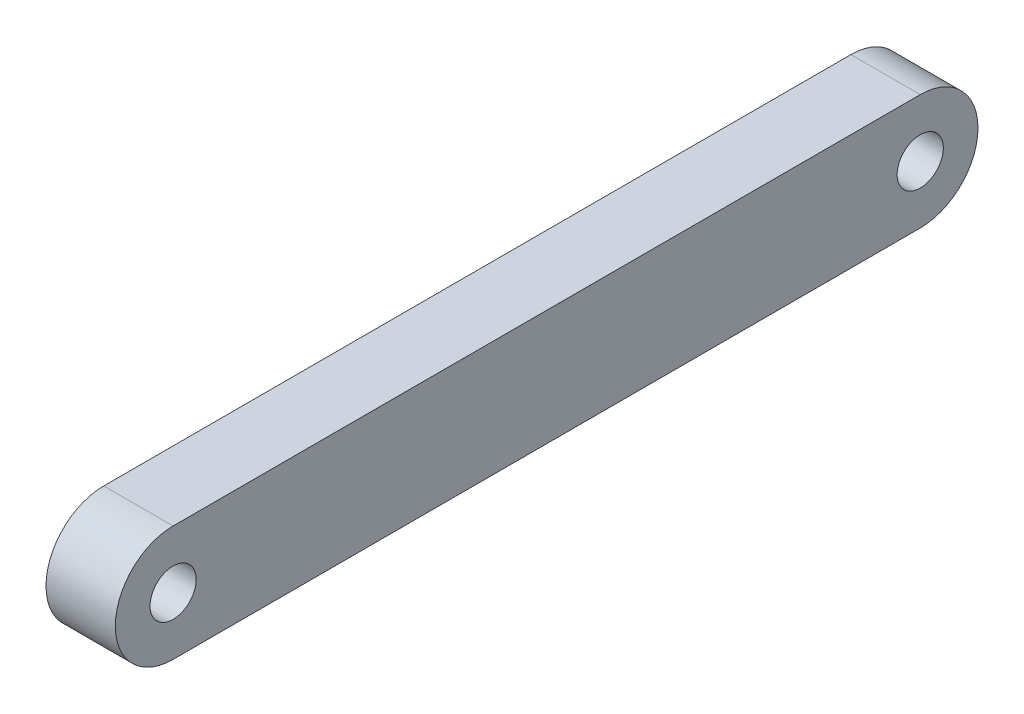
ISO-10303-21;
HEADER;
FILE_DESCRIPTION(('STEP AP214'),'2;1');
FILE_NAME('part.step','',(''),(''),'','','');
FILE_SCHEMA(('AUTOMOTIVE_DESIGN { 1 0 10303 214 1 1 1 1 }'));
ENDSEC;
DATA;
#1=APPLICATION_CONTEXT('core data for automotive mechanical design processes');
#2=APPLICATION_PROTOCOL_DEFINITION('international standard','automotive_design',2000,#1);
#3=PRODUCT_CONTEXT('',#1,'mechanical');
#4=PRODUCT('Part','Part','',(#3));
#5=PRODUCT_RELATED_PRODUCT_CATEGORY('part','',(#4));
#6=PRODUCT_DEFINITION_FORMATION('','',#4);
#7=PRODUCT_DEFINITION_CONTEXT('part definition',#1,'design');
#8=PRODUCT_DEFINITION('design','',#6,#7);
#9=PRODUCT_DEFINITION_SHAPE('','',#8);
#10=(LENGTH_UNIT() NAMED_UNIT(*) SI_UNIT(.MILLI.,.METRE.));
#11=(NAMED_UNIT(*) PLANE_ANGLE_UNIT() SI_UNIT($,.RADIAN.));
#12=(NAMED_UNIT(*) SI_UNIT($,.STERADIAN.) SOLID_ANGLE_UNIT());
#13=UNCERTAINTY_MEASURE_WITH_UNIT(LENGTH_MEASURE(1.E-05),#10,'distance_accuracy_value','');
#14=(GEOMETRIC_REPRESENTATION_CONTEXT(3) GLOBAL_UNCERTAINTY_ASSIGNED_CONTEXT((#13)) GLOBAL_UNIT_ASSIGNED_CONTEXT((#10,
#11,#12)) REPRESENTATION_CONTEXT('',''));
#15=CARTESIAN_POINT('',(0.,0.,0.));
#16=DIRECTION('',(0.,0.,1.));
#17=DIRECTION('',(1.,0.,0.));
#18=AXIS2_PLACEMENT_3D('',#15,#16,#17);
#19=CARTESIAN_POINT('',(3.,0.,32.325));
#20=DIRECTION('',(1.,0.,0.));
#21=DIRECTION('',(0.,0.,-1.));
#22=AXIS2_PLACEMENT_3D('',#19,#20,#21);
#23=PLANE('',#22);
#24=CARTESIAN_POINT('',(3.,0.,32.325));
#25=DIRECTION('',(1.,0.,0.));
#26=DIRECTION('',(0.,0.,-1.));
#27=AXIS2_PLACEMENT_3D('',#24,#25,#26);
#28=CIRCLE('',#27,2.);
#29=CARTESIAN_POINT('',(3.,0.,30.325));
#30=VERTEX_POINT('',#29);
#31=EDGE_CURVE('E100',#30,#30,#28,.T.);
#32=ORIENTED_EDGE('',*,*,#31,.F.);
#33=EDGE_LOOP('',(#32));
#34=FACE_BOUND('',#33,.T.);
#35=CARTESIAN_POINT('',(3.,0.,32.325));
#36=DIRECTION('',(1.,0.,0.));
#37=DIRECTION('',(0.,0.,-1.));
#38=AXIS2_PLACEMENT_3D('',#35,#36,#37);
#39=CIRCLE('',#38,5.);
#40=CARTESIAN_POINT('',(3.,5.00000000000001,32.325));
#41=VERTEX_POINT('',#40);
#42=CARTESIAN_POINT('',(3.,-4.99999999999999,32.325));
#43=VERTEX_POINT('',#42);
#44=EDGE_CURVE('E85',#41,#43,#39,.T.);
#45=ORIENTED_EDGE('',*,*,#44,.T.);
#46=DIRECTION('',(0.,0.,-1.));
#47=VECTOR('',#46,1.);
#48=CARTESIAN_POINT('',(3.,-4.99999999999999,32.325));
#49=LINE('',#48,#47);
#50=CARTESIAN_POINT('',(3.,-5.00000000000001,-32.325));
#51=VERTEX_POINT('',#50);
#52=EDGE_CURVE('E80',#43,#51,#49,.T.);
#53=ORIENTED_EDGE('',*,*,#52,.T.);
#54=CARTESIAN_POINT('',(3.,0.,-32.325));
#55=DIRECTION('',(1.,0.,0.));
#56=DIRECTION('',(0.,0.,-1.));
#57=AXIS2_PLACEMENT_3D('',#54,#55,#56);
#58=CIRCLE('',#57,5.00000000000001);
#59=CARTESIAN_POINT('',(3.,5.00000000000002,-32.325));
#60=VERTEX_POINT('',#59);
#61=EDGE_CURVE('E83',#51,#60,#58,.T.);
#62=ORIENTED_EDGE('',*,*,#61,.T.);
#63=DIRECTION('',(0.,0.,1.));
#64=VECTOR('',#63,1.);
#65=CARTESIAN_POINT('',(3.,5.00000000000001,32.325));
#66=LINE('',#65,#64);
#67=EDGE_CURVE('E50',#60,#41,#66,.T.);
#68=ORIENTED_EDGE('',*,*,#67,.T.);
#69=EDGE_LOOP('',(#45,#53,#62,#68));
#70=FACE_BOUND('',#69,.T.);
#71=CARTESIAN_POINT('',(3.,0.,-32.325));
#72=DIRECTION('',(1.,0.,0.));
#73=DIRECTION('',(0.,0.,-1.));
#74=AXIS2_PLACEMENT_3D('',#71,#72,#73);
#75=CIRCLE('',#74,2.);
#76=CARTESIAN_POINT('',(3.,0.,-34.325));
#77=VERTEX_POINT('',#76);
#78=EDGE_CURVE('E115',#77,#77,#75,.T.);
#79=ORIENTED_EDGE('',*,*,#78,.F.);
#80=EDGE_LOOP('',(#79));
#81=FACE_BOUND('',#80,.T.);
#82=ADVANCED_FACE('F33',(#34,#70,#81),#23,.T.);
#83=CARTESIAN_POINT('',(-3.,0.,32.325));
#84=DIRECTION('',(1.,0.,0.));
#85=DIRECTION('',(0.,0.,-1.));
#86=AXIS2_PLACEMENT_3D('',#83,#84,#85);
#87=PLANE('',#86);
#88=CARTESIAN_POINT('',(-3.,0.,32.325));
#89=DIRECTION('',(1.,0.,0.));
#90=DIRECTION('',(0.,0.,-1.));
#91=AXIS2_PLACEMENT_3D('',#88,#89,#90);
#92=CIRCLE('',#91,5.);
#93=CARTESIAN_POINT('',(-3.,5.00000000000001,32.325));
#94=VERTEX_POINT('',#93);
#95=CARTESIAN_POINT('',(-3.,-4.99999999999999,32.325));
#96=VERTEX_POINT('',#95);
#97=EDGE_CURVE('E97',#94,#96,#92,.T.);
#98=ORIENTED_EDGE('',*,*,#97,.F.);
#99=DIRECTION('',(0.,0.,1.));
#100=VECTOR('',#99,1.);
#101=CARTESIAN_POINT('',(-3.,5.00000000000001,32.325));
#102=LINE('',#101,#100);
#103=CARTESIAN_POINT('',(-3.,5.00000000000002,-32.325));
#104=VERTEX_POINT('',#103);
#105=EDGE_CURVE('E73',#104,#94,#102,.T.);
#106=ORIENTED_EDGE('',*,*,#105,.F.);
#107=CARTESIAN_POINT('',(-3.,0.,-32.325));
#108=DIRECTION('',(1.,0.,0.));
#109=DIRECTION('',(0.,0.,-1.));
#110=AXIS2_PLACEMENT_3D('',#107,#108,#109);
#111=CIRCLE('',#110,5.00000000000001);
#112=CARTESIAN_POINT('',(-3.,-5.00000000000001,-32.325));
#113=VERTEX_POINT('',#112);
#114=EDGE_CURVE('E67',#113,#104,#111,.T.);
#115=ORIENTED_EDGE('',*,*,#114,.F.);
#116=DIRECTION('',(0.,0.,-1.));
#117=VECTOR('',#116,1.);
#118=CARTESIAN_POINT('',(-3.,-4.99999999999999,32.325));
#119=LINE('',#118,#117);
#120=EDGE_CURVE('E89',#96,#113,#119,.T.);
#121=ORIENTED_EDGE('',*,*,#120,.F.);
#122=EDGE_LOOP('',(#98,#106,#115,#121));
#123=FACE_BOUND('',#122,.T.);
#124=CARTESIAN_POINT('',(-3.,0.,32.325));
#125=DIRECTION('',(1.,0.,0.));
#126=DIRECTION('',(0.,0.,-1.));
#127=AXIS2_PLACEMENT_3D('',#124,#125,#126);
#128=CIRCLE('',#127,2.);
#129=CARTESIAN_POINT('',(-3.,0.,30.325));
#130=VERTEX_POINT('',#129);
#131=EDGE_CURVE('E112',#130,#130,#128,.T.);
#132=ORIENTED_EDGE('',*,*,#131,.T.);
#133=EDGE_LOOP('',(#132));
#134=FACE_BOUND('',#133,.T.);
#135=CARTESIAN_POINT('',(-3.,0.,-32.325));
#136=DIRECTION('',(1.,0.,0.));
#137=DIRECTION('',(0.,0.,-1.));
#138=AXIS2_PLACEMENT_3D('',#135,#136,#137);
#139=CIRCLE('',#138,2.);
#140=CARTESIAN_POINT('',(-3.,0.,-34.325));
#141=VERTEX_POINT('',#140);
#142=EDGE_CURVE('E118',#141,#141,#139,.T.);
#143=ORIENTED_EDGE('',*,*,#142,.T.);
#144=EDGE_LOOP('',(#143));
#145=FACE_BOUND('',#144,.T.);
#146=ADVANCED_FACE('F108',(#123,#134,#145),#87,.F.);
#147=CARTESIAN_POINT('',(3.,0.,32.325));
#148=DIRECTION('',(-1.,0.,0.));
#149=DIRECTION('',(0.,0.,1.));
#150=AXIS2_PLACEMENT_3D('',#147,#148,#149);
#151=CYLINDRICAL_SURFACE('',#150,5.);
#152=ORIENTED_EDGE('',*,*,#97,.T.);
#153=DIRECTION('',(-1.,0.,0.));
#154=VECTOR('',#153,1.);
#155=CARTESIAN_POINT('',(3.,-4.99999999999999,32.325));
#156=LINE('',#155,#154);
#157=EDGE_CURVE('E11',#43,#96,#156,.T.);
#158=ORIENTED_EDGE('',*,*,#157,.F.);
#159=ORIENTED_EDGE('',*,*,#44,.F.);
#160=DIRECTION('',(-1.,0.,0.));
#161=VECTOR('',#160,1.);
#162=CARTESIAN_POINT('',(3.,5.00000000000001,32.325));
#163=LINE('',#162,#161);
#164=EDGE_CURVE('E93',#41,#94,#163,.T.);
#165=ORIENTED_EDGE('',*,*,#164,.T.);
#166=EDGE_LOOP('',(#152,#158,#159,#165));
#167=FACE_BOUND('',#166,.T.);
#168=ADVANCED_FACE('F35',(#167),#151,.T.);
#169=CARTESIAN_POINT('',(3.,-4.99999999999999,32.325));
#170=DIRECTION('',(0.,1.,0.));
#171=DIRECTION('',(0.,0.,1.));
#172=AXIS2_PLACEMENT_3D('',#169,#170,#171);
#173=PLANE('',#172);
#174=ORIENTED_EDGE('',*,*,#120,.T.);
#175=DIRECTION('',(-1.,0.,0.));
#176=VECTOR('',#175,1.);
#177=CARTESIAN_POINT('',(3.,-5.00000000000001,-32.325));
#178=LINE('',#177,#176);
#179=EDGE_CURVE('E42',#51,#113,#178,.T.);
#180=ORIENTED_EDGE('',*,*,#179,.F.);
#181=ORIENTED_EDGE('',*,*,#52,.F.);
#182=ORIENTED_EDGE('',*,*,#157,.T.);
#183=EDGE_LOOP('',(#174,#180,#181,#182));
#184=FACE_BOUND('',#183,.T.);
#185=ADVANCED_FACE('F88',(#184),#173,.F.);
#186=CARTESIAN_POINT('',(3.,0.,-32.325));
#187=DIRECTION('',(-1.,0.,0.));
#188=DIRECTION('',(0.,0.,1.));
#189=AXIS2_PLACEMENT_3D('',#186,#187,#188);
#190=CYLINDRICAL_SURFACE('',#189,5.00000000000001);
#191=ORIENTED_EDGE('',*,*,#114,.T.);
#192=DIRECTION('',(-1.,0.,0.));
#193=VECTOR('',#192,1.);
#194=CARTESIAN_POINT('',(3.,5.00000000000002,-32.325));
#195=LINE('',#194,#193);
#196=EDGE_CURVE('E90',#60,#104,#195,.T.);
#197=ORIENTED_EDGE('',*,*,#196,.F.);
#198=ORIENTED_EDGE('',*,*,#61,.F.);
#199=ORIENTED_EDGE('',*,*,#179,.T.);
#200=EDGE_LOOP('',(#191,#197,#198,#199));
#201=FACE_BOUND('',#200,.T.);
#202=ADVANCED_FACE('F91',(#201),#190,.T.);
#203=CARTESIAN_POINT('',(3.,5.00000000000001,32.325));
#204=DIRECTION('',(0.,-1.,0.));
#205=DIRECTION('',(0.,0.,-1.));
#206=AXIS2_PLACEMENT_3D('',#203,#204,#205);
#207=PLANE('',#206);
#208=ORIENTED_EDGE('',*,*,#105,.T.);
#209=ORIENTED_EDGE('',*,*,#164,.F.);
#210=ORIENTED_EDGE('',*,*,#67,.F.);
#211=ORIENTED_EDGE('',*,*,#196,.T.);
#212=EDGE_LOOP('',(#208,#209,#210,#211));
#213=FACE_BOUND('',#212,.T.);
#214=ADVANCED_FACE('F105',(#213),#207,.F.);
#215=CARTESIAN_POINT('',(3.,0.,32.325));
#216=DIRECTION('',(-1.,0.,0.));
#217=DIRECTION('',(0.,0.,1.));
#218=AXIS2_PLACEMENT_3D('',#215,#216,#217);
#219=CYLINDRICAL_SURFACE('',#218,2.);
#220=ORIENTED_EDGE('',*,*,#31,.T.);
#221=EDGE_LOOP('',(#220));
#222=FACE_BOUND('',#221,.T.);
#223=ORIENTED_EDGE('',*,*,#131,.F.);
#224=EDGE_LOOP('',(#223));
#225=FACE_BOUND('',#224,.T.);
#226=ADVANCED_FACE('F135',(#222,#225),#219,.F.);
#227=CARTESIAN_POINT('',(3.,0.,-32.325));
#228=DIRECTION('',(-1.,0.,0.));
#229=DIRECTION('',(0.,0.,1.));
#230=AXIS2_PLACEMENT_3D('',#227,#228,#229);
#231=CYLINDRICAL_SURFACE('',#230,2.);
#232=ORIENTED_EDGE('',*,*,#78,.T.);
#233=EDGE_LOOP('',(#232));
#234=FACE_BOUND('',#233,.T.);
#235=ORIENTED_EDGE('',*,*,#142,.F.);
#236=EDGE_LOOP('',(#235));
#237=FACE_BOUND('',#236,.T.);
#238=ADVANCED_FACE('F124',(#234,#237),#231,.F.);
#239=CLOSED_SHELL('',(#82,#146,#168,#185,#202,#214,#226,#238));
#240=MANIFOLD_SOLID_BREP('B2',#239);
#241=ADVANCED_BREP_SHAPE_REPRESENTATION('',(#18,#240),#14);
#242=SHAPE_DEFINITION_REPRESENTATION(#9,#241);
ENDSEC;
END-ISO-10303-21;
